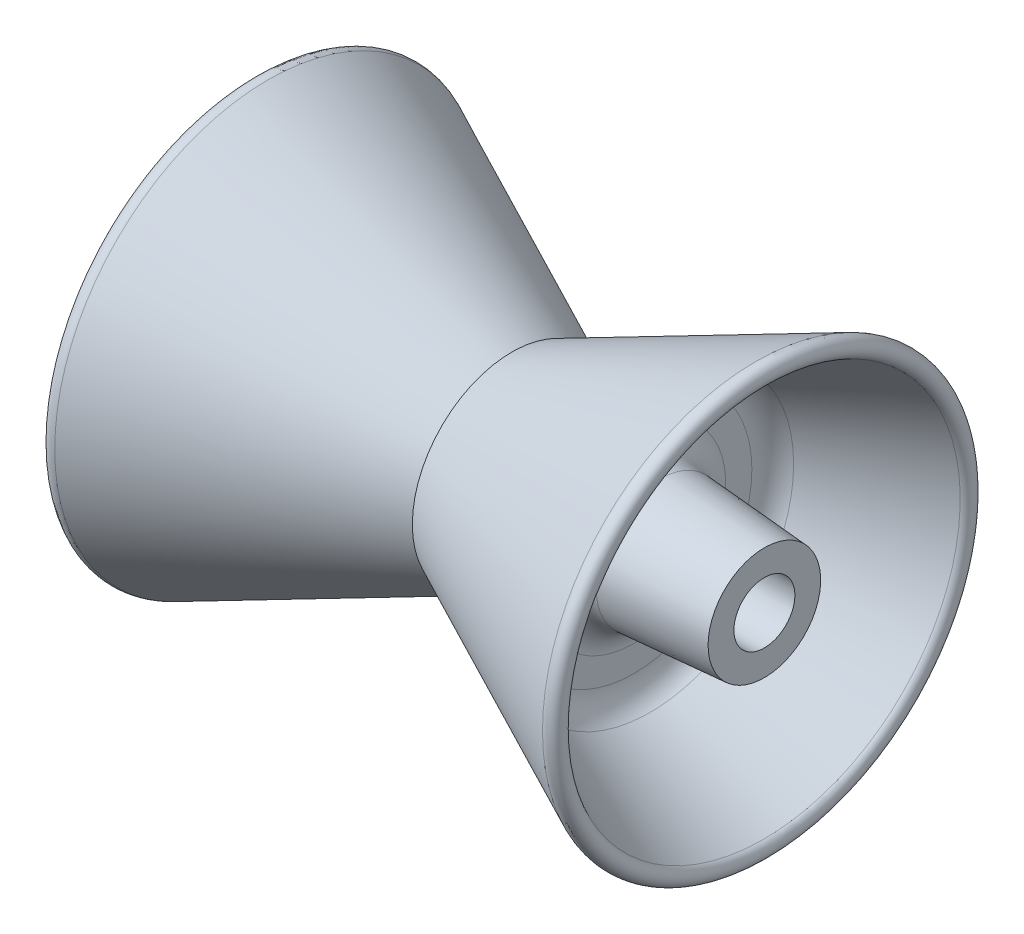
ISO-10303-21;
HEADER;
FILE_DESCRIPTION(('STEP AP214'),'2;1');
FILE_NAME('part.step','',(''),(''),'','','');
FILE_SCHEMA(('AUTOMOTIVE_DESIGN { 1 0 10303 214 1 1 1 1 }'));
ENDSEC;
DATA;
#1=APPLICATION_CONTEXT('core data for automotive mechanical design processes');
#2=APPLICATION_PROTOCOL_DEFINITION('international standard','automotive_design',2000,#1);
#3=PRODUCT_CONTEXT('',#1,'mechanical');
#4=PRODUCT('Part','Part','',(#3));
#5=PRODUCT_RELATED_PRODUCT_CATEGORY('part','',(#4));
#6=PRODUCT_DEFINITION_FORMATION('','',#4);
#7=PRODUCT_DEFINITION_CONTEXT('part definition',#1,'design');
#8=PRODUCT_DEFINITION('design','',#6,#7);
#9=PRODUCT_DEFINITION_SHAPE('','',#8);
#10=(LENGTH_UNIT() NAMED_UNIT(*) SI_UNIT(.MILLI.,.METRE.));
#11=(NAMED_UNIT(*) PLANE_ANGLE_UNIT() SI_UNIT($,.RADIAN.));
#12=(NAMED_UNIT(*) SI_UNIT($,.STERADIAN.) SOLID_ANGLE_UNIT());
#13=UNCERTAINTY_MEASURE_WITH_UNIT(LENGTH_MEASURE(1.E-05),#10,'distance_accuracy_value','');
#14=(GEOMETRIC_REPRESENTATION_CONTEXT(3) GLOBAL_UNCERTAINTY_ASSIGNED_CONTEXT((#13)) GLOBAL_UNIT_ASSIGNED_CONTEXT((#10,
#11,#12)) REPRESENTATION_CONTEXT('',''));
#15=CARTESIAN_POINT('',(0.,0.,0.));
#16=DIRECTION('',(0.,0.,1.));
#17=DIRECTION('',(1.,0.,0.));
#18=AXIS2_PLACEMENT_3D('',#15,#16,#17);
#19=CARTESIAN_POINT('',(13665.962,825.5,0.));
#20=DIRECTION('',(-1.,0.,0.));
#21=DIRECTION('',(0.,0.,1.));
#22=AXIS2_PLACEMENT_3D('',#19,#20,#21);
#23=PLANE('',#22);
#24=CARTESIAN_POINT('',(13665.962,0.,0.));
#25=DIRECTION('',(-1.,0.,0.));
#26=DIRECTION('',(0.,0.,1.));
#27=AXIS2_PLACEMENT_3D('',#24,#25,#26);
#28=CIRCLE('',#27,1524.);
#29=CARTESIAN_POINT('',(13665.962,0.,1524.));
#30=VERTEX_POINT('',#29);
#31=EDGE_CURVE('E47',#30,#30,#28,.T.);
#32=ORIENTED_EDGE('',*,*,#31,.F.);
#33=EDGE_LOOP('',(#32));
#34=FACE_BOUND('',#33,.T.);
#35=CARTESIAN_POINT('',(13665.962,0.,0.));
#36=DIRECTION('',(-1.,0.,0.));
#37=DIRECTION('',(0.,0.,1.));
#38=AXIS2_PLACEMENT_3D('',#35,#36,#37);
#39=CIRCLE('',#38,825.5);
#40=CARTESIAN_POINT('',(13665.962,0.,825.5));
#41=VERTEX_POINT('',#40);
#42=EDGE_CURVE('E10',#41,#41,#39,.T.);
#43=ORIENTED_EDGE('',*,*,#42,.T.);
#44=EDGE_LOOP('',(#43));
#45=FACE_BOUND('',#44,.T.);
#46=ADVANCED_FACE('F40',(#34,#45),#23,.F.);
#47=CARTESIAN_POINT('',(13665.962,0.,0.));
#48=DIRECTION('',(-1.,0.,0.));
#49=DIRECTION('',(0.,0.,1.));
#50=AXIS2_PLACEMENT_3D('',#47,#48,#49);
#51=CONICAL_SURFACE('',#50,1524.,0.0718109894154455);
#52=CARTESIAN_POINT('',(10842.3080441002,0.,0.));
#53=DIRECTION('',(-1.,0.,0.));
#54=DIRECTION('',(0.,0.,1.));
#55=AXIS2_PLACEMENT_3D('',#52,#53,#54);
#56=CIRCLE('',#55,1727.11865308778);
#57=CARTESIAN_POINT('',(10842.3080441002,0.,1727.11865308778));
#58=VERTEX_POINT('',#57);
#59=EDGE_CURVE('E52',#58,#58,#56,.T.);
#60=ORIENTED_EDGE('',*,*,#59,.F.);
#61=EDGE_LOOP('',(#60));
#62=FACE_BOUND('',#61,.T.);
#63=ORIENTED_EDGE('',*,*,#31,.T.);
#64=EDGE_LOOP('',(#63));
#65=FACE_BOUND('',#64,.T.);
#66=ADVANCED_FACE('F269',(#62,#65),#51,.T.);
#67=CARTESIAN_POINT('',(10896.981,0.,0.));
#68=DIRECTION('',(-1.,0.,0.));
#69=DIRECTION('',(0.,0.,1.));
#70=AXIS2_PLACEMENT_3D('',#67,#68,#69);
#71=TOROIDAL_SURFACE('',#70,2487.15474952872,761.999999999999);
#72=CARTESIAN_POINT('',(10134.981,0.,0.));
#73=DIRECTION('',(-1.,0.,0.));
#74=DIRECTION('',(0.,0.,1.));
#75=AXIS2_PLACEMENT_3D('',#72,#73,#74);
#76=CIRCLE('',#75,2487.15474952872);
#77=CARTESIAN_POINT('',(10134.981,0.,2487.15474952872));
#78=VERTEX_POINT('',#77);
#79=EDGE_CURVE('E57',#78,#78,#76,.T.);
#80=ORIENTED_EDGE('',*,*,#79,.F.);
#81=EDGE_LOOP('',(#80));
#82=FACE_BOUND('',#81,.T.);
#83=ORIENTED_EDGE('',*,*,#59,.T.);
#84=EDGE_LOOP('',(#83));
#85=FACE_BOUND('',#84,.T.);
#86=ADVANCED_FACE('F263',(#82,#85),#71,.F.);
#87=CARTESIAN_POINT('',(10134.981,2487.15474952872,0.));
#88=DIRECTION('',(-1.,0.,0.));
#89=DIRECTION('',(0.,0.,1.));
#90=AXIS2_PLACEMENT_3D('',#87,#88,#89);
#91=PLANE('',#90);
#92=CARTESIAN_POINT('',(10134.981,0.,0.));
#93=DIRECTION('',(-1.,0.,0.));
#94=DIRECTION('',(0.,0.,1.));
#95=AXIS2_PLACEMENT_3D('',#92,#93,#94);
#96=CIRCLE('',#95,3192.34203581407);
#97=CARTESIAN_POINT('',(10134.981,0.,3192.34203581407));
#98=VERTEX_POINT('',#97);
#99=EDGE_CURVE('E63',#98,#98,#96,.T.);
#100=ORIENTED_EDGE('',*,*,#99,.F.);
#101=EDGE_LOOP('',(#100));
#102=FACE_BOUND('',#101,.T.);
#103=ORIENTED_EDGE('',*,*,#79,.T.);
#104=EDGE_LOOP('',(#103));
#105=FACE_BOUND('',#104,.T.);
#106=ADVANCED_FACE('F257',(#102,#105),#91,.F.);
#107=CARTESIAN_POINT('',(10896.981,0.,0.));
#108=DIRECTION('',(-1.,0.,0.));
#109=DIRECTION('',(0.,0.,1.));
#110=AXIS2_PLACEMENT_3D('',#107,#108,#109);
#111=TOROIDAL_SURFACE('',#110,3192.34203581407,761.999999999987);
#112=CARTESIAN_POINT('',(10574.9458845536,0.,0.));
#113=DIRECTION('',(-1.,0.,0.));
#114=DIRECTION('',(0.,0.,1.));
#115=AXIS2_PLACEMENT_3D('',#112,#113,#114);
#116=CIRCLE('',#115,3882.94856953598);
#117=CARTESIAN_POINT('',(10574.9458845536,0.,3882.94856953598));
#118=VERTEX_POINT('',#117);
#119=EDGE_CURVE('E67',#118,#118,#116,.T.);
#120=ORIENTED_EDGE('',*,*,#119,.F.);
#121=EDGE_LOOP('',(#120));
#122=FACE_BOUND('',#121,.T.);
#123=ORIENTED_EDGE('',*,*,#99,.T.);
#124=EDGE_LOOP('',(#123));
#125=FACE_BOUND('',#124,.T.);
#126=ADVANCED_FACE('F251',(#122,#125),#111,.F.);
#127=CARTESIAN_POINT('',(10574.9458845536,0.,0.));
#128=DIRECTION('',(1.,0.,0.));
#129=DIRECTION('',(0.,0.,-1.));
#130=AXIS2_PLACEMENT_3D('',#127,#128,#129);
#131=CONICAL_SURFACE('',#130,3882.94856953598,0.436332312998591);
#132=CARTESIAN_POINT('',(13650.449899057,0.,0.));
#133=DIRECTION('',(-1.,0.,0.));
#134=DIRECTION('',(0.,0.,1.));
#135=AXIS2_PLACEMENT_3D('',#132,#133,#134);
#136=CIRCLE('',#135,5317.07964418538);
#137=CARTESIAN_POINT('',(13650.449899057,0.,5317.07964418538));
#138=VERTEX_POINT('',#137);
#139=EDGE_CURVE('E71',#138,#138,#136,.T.);
#140=ORIENTED_EDGE('',*,*,#139,.F.);
#141=EDGE_LOOP('',(#140));
#142=FACE_BOUND('',#141,.T.);
#143=ORIENTED_EDGE('',*,*,#119,.T.);
#144=EDGE_LOOP('',(#143));
#145=FACE_BOUND('',#144,.T.);
#146=ADVANCED_FACE('F245',(#142,#145),#131,.F.);
#147=CARTESIAN_POINT('',(13543.1048605748,0.,0.));
#148=DIRECTION('',(-1.,0.,0.));
#149=DIRECTION('',(0.,0.,1.));
#150=AXIS2_PLACEMENT_3D('',#147,#148,#149);
#151=TOROIDAL_SURFACE('',#150,5547.28182209269,254.);
#152=CARTESIAN_POINT('',(13435.7598220927,0.,0.));
#153=DIRECTION('',(-1.,0.,0.));
#154=DIRECTION('',(0.,0.,1.));
#155=AXIS2_PLACEMENT_3D('',#152,#153,#154);
#156=CIRCLE('',#155,5777.484);
#157=CARTESIAN_POINT('',(13435.7598220927,0.,5777.484));
#158=VERTEX_POINT('',#157);
#159=EDGE_CURVE('E75',#158,#158,#156,.T.);
#160=ORIENTED_EDGE('',*,*,#159,.F.);
#161=EDGE_LOOP('',(#160));
#162=FACE_BOUND('',#161,.T.);
#163=ORIENTED_EDGE('',*,*,#139,.T.);
#164=EDGE_LOOP('',(#163));
#165=FACE_BOUND('',#164,.T.);
#166=ADVANCED_FACE('F239',(#162,#165),#151,.T.);
#167=CARTESIAN_POINT('',(13435.7598220927,0.,0.));
#168=DIRECTION('',(1.,0.,0.));
#169=DIRECTION('',(0.,0.,-1.));
#170=AXIS2_PLACEMENT_3D('',#167,#168,#169);
#171=CONICAL_SURFACE('',#170,5777.484,0.436332312998739);
#172=CARTESIAN_POINT('',(6832.98100000047,0.,0.));
#173=DIRECTION('',(-1.,0.,0.));
#174=DIRECTION('',(0.,0.,1.));
#175=AXIS2_PLACEMENT_3D('',#172,#173,#174);
#176=CIRCLE('',#175,2698.5576701535);
#177=CARTESIAN_POINT('',(6832.98100000047,0.,2698.5576701535));
#178=VERTEX_POINT('',#177);
#179=EDGE_CURVE('E79',#178,#178,#176,.T.);
#180=ORIENTED_EDGE('',*,*,#179,.F.);
#181=EDGE_LOOP('',(#180));
#182=FACE_BOUND('',#181,.T.);
#183=ORIENTED_EDGE('',*,*,#159,.T.);
#184=EDGE_LOOP('',(#183));
#185=FACE_BOUND('',#184,.T.);
#186=ADVANCED_FACE('F233',(#182,#185),#171,.T.);
#187=CARTESIAN_POINT('',(6832.98100000047,0.,0.));
#188=DIRECTION('',(-1.,0.,0.));
#189=DIRECTION('',(0.,0.,1.));
#190=AXIS2_PLACEMENT_3D('',#187,#188,#189);
#191=CONICAL_SURFACE('',#190,2698.5576701535,0.436332312998684);
#192=CARTESIAN_POINT('',(230.202177908115,0.,0.));
#193=DIRECTION('',(-1.,0.,0.));
#194=DIRECTION('',(0.,0.,1.));
#195=AXIS2_PLACEMENT_3D('',#192,#193,#194);
#196=CIRCLE('',#195,5777.48399999962);
#197=CARTESIAN_POINT('',(230.202177908115,0.,5777.48399999962));
#198=VERTEX_POINT('',#197);
#199=EDGE_CURVE('E83',#198,#198,#196,.T.);
#200=ORIENTED_EDGE('',*,*,#199,.F.);
#201=EDGE_LOOP('',(#200));
#202=FACE_BOUND('',#201,.T.);
#203=ORIENTED_EDGE('',*,*,#179,.T.);
#204=EDGE_LOOP('',(#203));
#205=FACE_BOUND('',#204,.T.);
#206=ADVANCED_FACE('F227',(#202,#205),#191,.T.);
#207=CARTESIAN_POINT('',(122.857139425166,0.,0.));
#208=DIRECTION('',(-1.,0.,0.));
#209=DIRECTION('',(0.,0.,1.));
#210=AXIS2_PLACEMENT_3D('',#207,#208,#209);
#211=TOROIDAL_SURFACE('',#210,5547.28182209269,254.000000000001);
#212=CARTESIAN_POINT('',(15.5121009430271,0.,0.));
#213=DIRECTION('',(-1.,0.,0.));
#214=DIRECTION('',(0.,0.,1.));
#215=AXIS2_PLACEMENT_3D('',#212,#213,#214);
#216=CIRCLE('',#215,5317.07964418538);
#217=CARTESIAN_POINT('',(15.5121009430271,0.,5317.07964418538));
#218=VERTEX_POINT('',#217);
#219=EDGE_CURVE('E87',#218,#218,#216,.T.);
#220=ORIENTED_EDGE('',*,*,#219,.F.);
#221=EDGE_LOOP('',(#220));
#222=FACE_BOUND('',#221,.T.);
#223=ORIENTED_EDGE('',*,*,#199,.T.);
#224=EDGE_LOOP('',(#223));
#225=FACE_BOUND('',#224,.T.);
#226=ADVANCED_FACE('F221',(#222,#225),#211,.T.);
#227=CARTESIAN_POINT('',(15.5121009430271,0.,0.));
#228=DIRECTION('',(-1.,0.,0.));
#229=DIRECTION('',(0.,0.,1.));
#230=AXIS2_PLACEMENT_3D('',#227,#228,#229);
#231=CONICAL_SURFACE('',#230,5317.07964418538,0.436332312998587);
#232=CARTESIAN_POINT('',(3091.01611544642,0.,0.));
#233=DIRECTION('',(-1.,0.,0.));
#234=DIRECTION('',(0.,0.,1.));
#235=AXIS2_PLACEMENT_3D('',#232,#233,#234);
#236=CIRCLE('',#235,3882.94856953599);
#237=CARTESIAN_POINT('',(3091.01611544642,0.,3882.94856953599));
#238=VERTEX_POINT('',#237);
#239=EDGE_CURVE('E91',#238,#238,#236,.T.);
#240=ORIENTED_EDGE('',*,*,#239,.F.);
#241=EDGE_LOOP('',(#240));
#242=FACE_BOUND('',#241,.T.);
#243=ORIENTED_EDGE('',*,*,#219,.T.);
#244=EDGE_LOOP('',(#243));
#245=FACE_BOUND('',#244,.T.);
#246=ADVANCED_FACE('F215',(#242,#245),#231,.F.);
#247=CARTESIAN_POINT('',(2768.981,0.,0.));
#248=DIRECTION('',(-1.,0.,0.));
#249=DIRECTION('',(0.,0.,1.));
#250=AXIS2_PLACEMENT_3D('',#247,#248,#249);
#251=TOROIDAL_SURFACE('',#250,3192.34203581407,761.999999999999);
#252=CARTESIAN_POINT('',(3530.981,0.,0.));
#253=DIRECTION('',(-1.,0.,0.));
#254=DIRECTION('',(0.,0.,1.));
#255=AXIS2_PLACEMENT_3D('',#252,#253,#254);
#256=CIRCLE('',#255,3192.34203581407);
#257=CARTESIAN_POINT('',(3530.981,0.,3192.34203581407));
#258=VERTEX_POINT('',#257);
#259=EDGE_CURVE('E95',#258,#258,#256,.T.);
#260=ORIENTED_EDGE('',*,*,#259,.F.);
#261=EDGE_LOOP('',(#260));
#262=FACE_BOUND('',#261,.T.);
#263=ORIENTED_EDGE('',*,*,#239,.T.);
#264=EDGE_LOOP('',(#263));
#265=FACE_BOUND('',#264,.T.);
#266=ADVANCED_FACE('F209',(#262,#265),#251,.F.);
#267=CARTESIAN_POINT('',(3530.981,2487.15474952872,0.));
#268=DIRECTION('',(1.,0.,0.));
#269=DIRECTION('',(0.,0.,-1.));
#270=AXIS2_PLACEMENT_3D('',#267,#268,#269);
#271=PLANE('',#270);
#272=CARTESIAN_POINT('',(3530.981,0.,0.));
#273=DIRECTION('',(-1.,0.,0.));
#274=DIRECTION('',(0.,0.,1.));
#275=AXIS2_PLACEMENT_3D('',#272,#273,#274);
#276=CIRCLE('',#275,2487.15474952872);
#277=CARTESIAN_POINT('',(3530.981,0.,2487.15474952872));
#278=VERTEX_POINT('',#277);
#279=EDGE_CURVE('E99',#278,#278,#276,.T.);
#280=ORIENTED_EDGE('',*,*,#279,.F.);
#281=EDGE_LOOP('',(#280));
#282=FACE_BOUND('',#281,.T.);
#283=ORIENTED_EDGE('',*,*,#259,.T.);
#284=EDGE_LOOP('',(#283));
#285=FACE_BOUND('',#284,.T.);
#286=ADVANCED_FACE('F203',(#282,#285),#271,.F.);
#287=CARTESIAN_POINT('',(2768.981,0.,0.));
#288=DIRECTION('',(-1.,0.,0.));
#289=DIRECTION('',(0.,0.,1.));
#290=AXIS2_PLACEMENT_3D('',#287,#288,#289);
#291=TOROIDAL_SURFACE('',#290,2487.15474952872,761.999999999999);
#292=CARTESIAN_POINT('',(2823.65395589979,0.,0.));
#293=DIRECTION('',(-1.,0.,0.));
#294=DIRECTION('',(0.,0.,1.));
#295=AXIS2_PLACEMENT_3D('',#292,#293,#294);
#296=CIRCLE('',#295,1727.11865308778);
#297=CARTESIAN_POINT('',(2823.65395589979,0.,1727.11865308778));
#298=VERTEX_POINT('',#297);
#299=EDGE_CURVE('E103',#298,#298,#296,.T.);
#300=ORIENTED_EDGE('',*,*,#299,.F.);
#301=EDGE_LOOP('',(#300));
#302=FACE_BOUND('',#301,.T.);
#303=ORIENTED_EDGE('',*,*,#279,.T.);
#304=EDGE_LOOP('',(#303));
#305=FACE_BOUND('',#304,.T.);
#306=ADVANCED_FACE('F197',(#302,#305),#291,.F.);
#307=CARTESIAN_POINT('',(2823.65395589979,0.,0.));
#308=DIRECTION('',(1.,0.,0.));
#309=DIRECTION('',(0.,0.,-1.));
#310=AXIS2_PLACEMENT_3D('',#307,#308,#309);
#311=CONICAL_SURFACE('',#310,1727.11865308778,0.0718109894154449);
#312=CARTESIAN_POINT('',(0.,0.,0.));
#313=DIRECTION('',(-1.,0.,0.));
#314=DIRECTION('',(0.,0.,1.));
#315=AXIS2_PLACEMENT_3D('',#312,#313,#314);
#316=CIRCLE('',#315,1524.);
#317=CARTESIAN_POINT('',(0.,0.,1524.));
#318=VERTEX_POINT('',#317);
#319=EDGE_CURVE('E107',#318,#318,#316,.T.);
#320=ORIENTED_EDGE('',*,*,#319,.F.);
#321=EDGE_LOOP('',(#320));
#322=FACE_BOUND('',#321,.T.);
#323=ORIENTED_EDGE('',*,*,#299,.T.);
#324=EDGE_LOOP('',(#323));
#325=FACE_BOUND('',#324,.T.);
#326=ADVANCED_FACE('F191',(#322,#325),#311,.T.);
#327=CARTESIAN_POINT('',(0.,825.5,0.));
#328=DIRECTION('',(1.,0.,0.));
#329=DIRECTION('',(0.,0.,-1.));
#330=AXIS2_PLACEMENT_3D('',#327,#328,#329);
#331=PLANE('',#330);
#332=CARTESIAN_POINT('',(0.,0.,0.));
#333=DIRECTION('',(-1.,0.,0.));
#334=DIRECTION('',(0.,0.,1.));
#335=AXIS2_PLACEMENT_3D('',#332,#333,#334);
#336=CIRCLE('',#335,825.5);
#337=CARTESIAN_POINT('',(0.,0.,825.5));
#338=VERTEX_POINT('',#337);
#339=EDGE_CURVE('E111',#338,#338,#336,.T.);
#340=ORIENTED_EDGE('',*,*,#339,.F.);
#341=EDGE_LOOP('',(#340));
#342=FACE_BOUND('',#341,.T.);
#343=ORIENTED_EDGE('',*,*,#319,.T.);
#344=EDGE_LOOP('',(#343));
#345=FACE_BOUND('',#344,.T.);
#346=ADVANCED_FACE('F185',(#342,#345),#331,.F.);
#347=CARTESIAN_POINT('',(0.,0.,0.));
#348=DIRECTION('',(-1.,0.,0.));
#349=DIRECTION('',(0.,0.,1.));
#350=AXIS2_PLACEMENT_3D('',#347,#348,#349);
#351=CYLINDRICAL_SURFACE('',#350,825.499999999999);
#352=CARTESIAN_POINT('',(4038.981,0.,0.));
#353=DIRECTION('',(-1.,0.,0.));
#354=DIRECTION('',(0.,0.,1.));
#355=AXIS2_PLACEMENT_3D('',#352,#353,#354);
#356=CIRCLE('',#355,825.499999999998);
#357=CARTESIAN_POINT('',(4038.981,0.,825.499999999998));
#358=VERTEX_POINT('',#357);
#359=EDGE_CURVE('E115',#358,#358,#356,.T.);
#360=ORIENTED_EDGE('',*,*,#359,.F.);
#361=EDGE_LOOP('',(#360));
#362=FACE_BOUND('',#361,.T.);
#363=ORIENTED_EDGE('',*,*,#339,.T.);
#364=EDGE_LOOP('',(#363));
#365=FACE_BOUND('',#364,.T.);
#366=ADVANCED_FACE('F179',(#362,#365),#351,.F.);
#367=CARTESIAN_POINT('',(4038.981,2411.68420912457,0.));
#368=DIRECTION('',(-1.,0.,0.));
#369=DIRECTION('',(0.,0.,1.));
#370=AXIS2_PLACEMENT_3D('',#367,#368,#369);
#371=PLANE('',#370);
#372=CARTESIAN_POINT('',(4038.981,0.,0.));
#373=DIRECTION('',(-1.,0.,0.));
#374=DIRECTION('',(0.,0.,1.));
#375=AXIS2_PLACEMENT_3D('',#372,#373,#374);
#376=CIRCLE('',#375,2411.68420912457);
#377=CARTESIAN_POINT('',(4038.981,0.,2411.68420912457));
#378=VERTEX_POINT('',#377);
#379=EDGE_CURVE('E119',#378,#378,#376,.T.);
#380=ORIENTED_EDGE('',*,*,#379,.F.);
#381=EDGE_LOOP('',(#380));
#382=FACE_BOUND('',#381,.T.);
#383=ORIENTED_EDGE('',*,*,#359,.T.);
#384=EDGE_LOOP('',(#383));
#385=FACE_BOUND('',#384,.T.);
#386=ADVANCED_FACE('F173',(#382,#385),#371,.F.);
#387=CARTESIAN_POINT('',(4728.12350961104,0.,0.));
#388=DIRECTION('',(-1.,0.,0.));
#389=DIRECTION('',(0.,0.,1.));
#390=AXIS2_PLACEMENT_3D('',#387,#388,#389);
#391=TOROIDAL_SURFACE('',#390,2411.68420912457,689.142509611044);
#392=CARTESIAN_POINT('',(5019.36771911464,0.,0.));
#393=DIRECTION('',(-1.,0.,0.));
#394=DIRECTION('',(0.,0.,1.));
#395=AXIS2_PLACEMENT_3D('',#392,#393,#394);
#396=CIRCLE('',#395,3036.25943196296);
#397=CARTESIAN_POINT('',(5019.36771911464,0.,3036.25943196296));
#398=VERTEX_POINT('',#397);
#399=EDGE_CURVE('E123',#398,#398,#396,.T.);
#400=ORIENTED_EDGE('',*,*,#399,.F.);
#401=EDGE_LOOP('',(#400));
#402=FACE_BOUND('',#401,.T.);
#403=ORIENTED_EDGE('',*,*,#379,.T.);
#404=EDGE_LOOP('',(#403));
#405=FACE_BOUND('',#404,.T.);
#406=ADVANCED_FACE('F167',(#402,#405),#391,.F.);
#407=CARTESIAN_POINT('',(5019.36771911464,0.,0.));
#408=DIRECTION('',(-1.,0.,0.));
#409=DIRECTION('',(0.,0.,1.));
#410=AXIS2_PLACEMENT_3D('',#407,#408,#409);
#411=CONICAL_SURFACE('',#410,3036.25943196296,0.436332312998728);
#412=CARTESIAN_POINT('',(6832.98100000003,0.,0.));
#413=DIRECTION('',(-1.,0.,0.));
#414=DIRECTION('',(0.,0.,1.));
#415=AXIS2_PLACEMENT_3D('',#412,#413,#414);
#416=CIRCLE('',#415,2190.55767015417);
#417=CARTESIAN_POINT('',(6832.98100000003,0.,2190.55767015417));
#418=VERTEX_POINT('',#417);
#419=EDGE_CURVE('E127',#418,#418,#416,.T.);
#420=ORIENTED_EDGE('',*,*,#419,.F.);
#421=EDGE_LOOP('',(#420));
#422=FACE_BOUND('',#421,.T.);
#423=ORIENTED_EDGE('',*,*,#399,.T.);
#424=EDGE_LOOP('',(#423));
#425=FACE_BOUND('',#424,.T.);
#426=ADVANCED_FACE('F161',(#422,#425),#411,.F.);
#427=CARTESIAN_POINT('',(6832.98100000003,0.,0.));
#428=DIRECTION('',(1.,0.,0.));
#429=DIRECTION('',(0.,0.,-1.));
#430=AXIS2_PLACEMENT_3D('',#427,#428,#429);
#431=CONICAL_SURFACE('',#430,2190.55767015417,0.436332312998742);
#432=CARTESIAN_POINT('',(8646.59428088541,0.,0.));
#433=DIRECTION('',(-1.,0.,0.));
#434=DIRECTION('',(0.,0.,1.));
#435=AXIS2_PLACEMENT_3D('',#432,#433,#434);
#436=CIRCLE('',#435,3036.25943196299);
#437=CARTESIAN_POINT('',(8646.59428088541,0.,3036.25943196299));
#438=VERTEX_POINT('',#437);
#439=EDGE_CURVE('E131',#438,#438,#436,.T.);
#440=ORIENTED_EDGE('',*,*,#439,.F.);
#441=EDGE_LOOP('',(#440));
#442=FACE_BOUND('',#441,.T.);
#443=ORIENTED_EDGE('',*,*,#419,.T.);
#444=EDGE_LOOP('',(#443));
#445=FACE_BOUND('',#444,.T.);
#446=ADVANCED_FACE('F155',(#442,#445),#431,.F.);
#447=CARTESIAN_POINT('',(8937.83849038896,0.,0.));
#448=DIRECTION('',(-1.,0.,0.));
#449=DIRECTION('',(0.,0.,1.));
#450=AXIS2_PLACEMENT_3D('',#447,#448,#449);
#451=TOROIDAL_SURFACE('',#450,2411.68420912457,689.142509611043);
#452=CARTESIAN_POINT('',(9626.981,0.,0.));
#453=DIRECTION('',(-1.,0.,0.));
#454=DIRECTION('',(0.,0.,1.));
#455=AXIS2_PLACEMENT_3D('',#452,#453,#454);
#456=CIRCLE('',#455,2411.68420912457);
#457=CARTESIAN_POINT('',(9626.981,0.,2411.68420912457));
#458=VERTEX_POINT('',#457);
#459=EDGE_CURVE('E135',#458,#458,#456,.T.);
#460=ORIENTED_EDGE('',*,*,#459,.F.);
#461=EDGE_LOOP('',(#460));
#462=FACE_BOUND('',#461,.T.);
#463=ORIENTED_EDGE('',*,*,#439,.T.);
#464=EDGE_LOOP('',(#463));
#465=FACE_BOUND('',#464,.T.);
#466=ADVANCED_FACE('F149',(#462,#465),#451,.F.);
#467=CARTESIAN_POINT('',(9626.981,2411.68420912457,0.));
#468=DIRECTION('',(1.,0.,0.));
#469=DIRECTION('',(0.,0.,-1.));
#470=AXIS2_PLACEMENT_3D('',#467,#468,#469);
#471=PLANE('',#470);
#472=CARTESIAN_POINT('',(9626.981,0.,0.));
#473=DIRECTION('',(-1.,0.,0.));
#474=DIRECTION('',(0.,0.,1.));
#475=AXIS2_PLACEMENT_3D('',#472,#473,#474);
#476=CIRCLE('',#475,825.5);
#477=CARTESIAN_POINT('',(9626.981,0.,825.5));
#478=VERTEX_POINT('',#477);
#479=EDGE_CURVE('E139',#478,#478,#476,.T.);
#480=ORIENTED_EDGE('',*,*,#479,.F.);
#481=EDGE_LOOP('',(#480));
#482=FACE_BOUND('',#481,.T.);
#483=ORIENTED_EDGE('',*,*,#459,.T.);
#484=EDGE_LOOP('',(#483));
#485=FACE_BOUND('',#484,.T.);
#486=ADVANCED_FACE('F146',(#482,#485),#471,.F.);
#487=CARTESIAN_POINT('',(0.,0.,0.));
#488=DIRECTION('',(-1.,0.,0.));
#489=DIRECTION('',(0.,0.,1.));
#490=AXIS2_PLACEMENT_3D('',#487,#488,#489);
#491=CYLINDRICAL_SURFACE('',#490,825.5);
#492=ORIENTED_EDGE('',*,*,#42,.F.);
#493=EDGE_LOOP('',(#492));
#494=FACE_BOUND('',#493,.T.);
#495=ORIENTED_EDGE('',*,*,#479,.T.);
#496=EDGE_LOOP('',(#495));
#497=FACE_BOUND('',#496,.T.);
#498=ADVANCED_FACE('F144',(#494,#497),#491,.F.);
#499=CLOSED_SHELL('',(#46,#66,#86,#106,#126,#146,#166,#186,#206,#226,#246,#266,#286,#306,#326,
#346,#366,#386,#406,#426,#446,#466,#486,#498));
#500=MANIFOLD_SOLID_BREP('B2',#499);
#501=ADVANCED_BREP_SHAPE_REPRESENTATION('',(#18,#500),#14);
#502=SHAPE_DEFINITION_REPRESENTATION(#9,#501);
ENDSEC;
END-ISO-10303-21;
